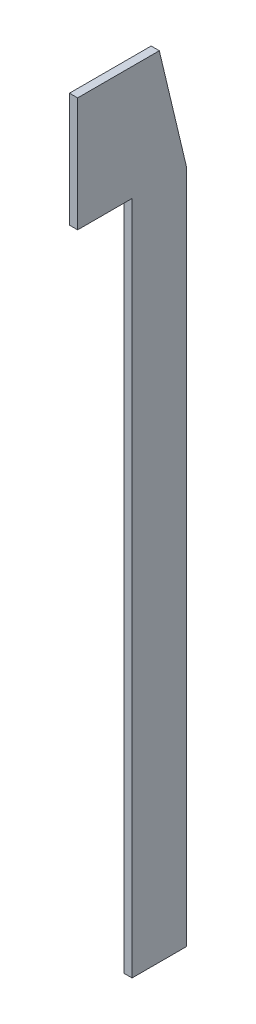
ISO-10303-21;
HEADER;
FILE_DESCRIPTION(('STEP AP214'),'2;1');
FILE_NAME('part.step','',(''),(''),'','','');
FILE_SCHEMA(('AUTOMOTIVE_DESIGN { 1 0 10303 214 1 1 1 1 }'));
ENDSEC;
DATA;
#1=APPLICATION_CONTEXT('core data for automotive mechanical design processes');
#2=APPLICATION_PROTOCOL_DEFINITION('international standard','automotive_design',2000,#1);
#3=PRODUCT_CONTEXT('',#1,'mechanical');
#4=PRODUCT('Part','Part','',(#3));
#5=PRODUCT_RELATED_PRODUCT_CATEGORY('part','',(#4));
#6=PRODUCT_DEFINITION_FORMATION('','',#4);
#7=PRODUCT_DEFINITION_CONTEXT('part definition',#1,'design');
#8=PRODUCT_DEFINITION('design','',#6,#7);
#9=PRODUCT_DEFINITION_SHAPE('','',#8);
#10=(LENGTH_UNIT() NAMED_UNIT(*) SI_UNIT(.MILLI.,.METRE.));
#11=(NAMED_UNIT(*) PLANE_ANGLE_UNIT() SI_UNIT($,.RADIAN.));
#12=(NAMED_UNIT(*) SI_UNIT($,.STERADIAN.) SOLID_ANGLE_UNIT());
#13=UNCERTAINTY_MEASURE_WITH_UNIT(LENGTH_MEASURE(1.E-05),#10,'distance_accuracy_value','');
#14=(GEOMETRIC_REPRESENTATION_CONTEXT(3) GLOBAL_UNCERTAINTY_ASSIGNED_CONTEXT((#13)) GLOBAL_UNIT_ASSIGNED_CONTEXT((#10,
#11,#12)) REPRESENTATION_CONTEXT('',''));
#15=CARTESIAN_POINT('',(0.,0.,0.));
#16=DIRECTION('',(0.,0.,1.));
#17=DIRECTION('',(1.,0.,0.));
#18=AXIS2_PLACEMENT_3D('',#15,#16,#17);
#19=CARTESIAN_POINT('',(3.,0.,0.));
#20=DIRECTION('',(0.,0.,-1.));
#21=DIRECTION('',(-1.,0.,0.));
#22=AXIS2_PLACEMENT_3D('',#19,#20,#21);
#23=PLANE('',#22);
#24=DIRECTION('',(0.,-1.,0.));
#25=VECTOR('',#24,1.);
#26=CARTESIAN_POINT('',(0.,0.,0.));
#27=LINE('',#26,#25);
#28=CARTESIAN_POINT('',(0.,248.,0.));
#29=VERTEX_POINT('',#28);
#30=CARTESIAN_POINT('',(0.,0.,0.));
#31=VERTEX_POINT('',#30);
#32=EDGE_CURVE('E124',#29,#31,#27,.T.);
#33=ORIENTED_EDGE('',*,*,#32,.T.);
#34=DIRECTION('',(-1.,0.,0.));
#35=VECTOR('',#34,1.);
#36=CARTESIAN_POINT('',(3.,0.,0.));
#37=LINE('',#36,#35);
#38=CARTESIAN_POINT('',(3.,0.,0.));
#39=VERTEX_POINT('',#38);
#40=EDGE_CURVE('E11',#39,#31,#37,.T.);
#41=ORIENTED_EDGE('',*,*,#40,.F.);
#42=DIRECTION('',(0.,-1.,0.));
#43=VECTOR('',#42,1.);
#44=CARTESIAN_POINT('',(3.,0.,0.));
#45=LINE('',#44,#43);
#46=CARTESIAN_POINT('',(3.,248.,0.));
#47=VERTEX_POINT('',#46);
#48=EDGE_CURVE('E136',#47,#39,#45,.T.);
#49=ORIENTED_EDGE('',*,*,#48,.F.);
#50=DIRECTION('',(-1.,0.,0.));
#51=VECTOR('',#50,1.);
#52=CARTESIAN_POINT('',(3.,248.,0.));
#53=LINE('',#52,#51);
#54=EDGE_CURVE('E120',#47,#29,#53,.T.);
#55=ORIENTED_EDGE('',*,*,#54,.T.);
#56=EDGE_LOOP('',(#33,#41,#49,#55));
#57=FACE_BOUND('',#56,.T.);
#58=ADVANCED_FACE('F33',(#57),#23,.F.);
#59=CARTESIAN_POINT('',(3.,0.,0.));
#60=DIRECTION('',(0.,1.,0.));
#61=DIRECTION('',(0.,0.,1.));
#62=AXIS2_PLACEMENT_3D('',#59,#60,#61);
#63=PLANE('',#62);
#64=DIRECTION('',(0.,0.,-1.));
#65=VECTOR('',#64,1.);
#66=CARTESIAN_POINT('',(0.,0.,0.));
#67=LINE('',#66,#65);
#68=CARTESIAN_POINT('',(0.,0.,-20.));
#69=VERTEX_POINT('',#68);
#70=EDGE_CURVE('E127',#31,#69,#67,.T.);
#71=ORIENTED_EDGE('',*,*,#70,.T.);
#72=DIRECTION('',(-1.,0.,0.));
#73=VECTOR('',#72,1.);
#74=CARTESIAN_POINT('',(3.,0.,-20.));
#75=LINE('',#74,#73);
#76=CARTESIAN_POINT('',(3.,0.,-20.));
#77=VERTEX_POINT('',#76);
#78=EDGE_CURVE('E40',#77,#69,#75,.T.);
#79=ORIENTED_EDGE('',*,*,#78,.F.);
#80=DIRECTION('',(0.,0.,-1.));
#81=VECTOR('',#80,1.);
#82=CARTESIAN_POINT('',(3.,0.,0.));
#83=LINE('',#82,#81);
#84=EDGE_CURVE('E88',#39,#77,#83,.T.);
#85=ORIENTED_EDGE('',*,*,#84,.F.);
#86=ORIENTED_EDGE('',*,*,#40,.T.);
#87=EDGE_LOOP('',(#71,#79,#85,#86));
#88=FACE_BOUND('',#87,.T.);
#89=ADVANCED_FACE('F165',(#88),#63,.F.);
#90=CARTESIAN_POINT('',(3.,0.,-20.));
#91=DIRECTION('',(0.,0.,1.));
#92=DIRECTION('',(1.,0.,0.));
#93=AXIS2_PLACEMENT_3D('',#90,#91,#92);
#94=PLANE('',#93);
#95=DIRECTION('',(0.,1.,0.));
#96=VECTOR('',#95,1.);
#97=CARTESIAN_POINT('',(0.,0.,-20.));
#98=LINE('',#97,#96);
#99=CARTESIAN_POINT('',(0.,248.,-20.));
#100=VERTEX_POINT('',#99);
#101=EDGE_CURVE('E129',#69,#100,#98,.T.);
#102=ORIENTED_EDGE('',*,*,#101,.T.);
#103=DIRECTION('',(1.,0.,0.));
#104=VECTOR('',#103,1.);
#105=CARTESIAN_POINT('',(0.,248.,-20.));
#106=LINE('',#105,#104);
#107=CARTESIAN_POINT('',(3.,248.,-20.));
#108=VERTEX_POINT('',#107);
#109=EDGE_CURVE('E47',#100,#108,#106,.T.);
#110=ORIENTED_EDGE('',*,*,#109,.T.);
#111=DIRECTION('',(0.,1.,0.));
#112=VECTOR('',#111,1.);
#113=CARTESIAN_POINT('',(3.,0.,-20.));
#114=LINE('',#113,#112);
#115=EDGE_CURVE('E107',#77,#108,#114,.T.);
#116=ORIENTED_EDGE('',*,*,#115,.F.);
#117=ORIENTED_EDGE('',*,*,#78,.T.);
#118=EDGE_LOOP('',(#102,#110,#116,#117));
#119=FACE_BOUND('',#118,.T.);
#120=ADVANCED_FACE('F142',(#119),#94,.F.);
#121=CARTESIAN_POINT('',(3.,290.,-20.));
#122=DIRECTION('',(0.,-1.,0.));
#123=DIRECTION('',(0.,0.,-1.));
#124=AXIS2_PLACEMENT_3D('',#121,#122,#123);
#125=PLANE('',#124);
#126=DIRECTION('',(0.,0.,1.));
#127=VECTOR('',#126,1.);
#128=CARTESIAN_POINT('',(3.,290.,-20.));
#129=LINE('',#128,#127);
#130=CARTESIAN_POINT('',(3.,290.,-9.99999999999999));
#131=VERTEX_POINT('',#130);
#132=CARTESIAN_POINT('',(3.,290.,20.));
#133=VERTEX_POINT('',#132);
#134=EDGE_CURVE('E96',#131,#133,#129,.T.);
#135=ORIENTED_EDGE('',*,*,#134,.F.);
#136=DIRECTION('',(1.,0.,0.));
#137=VECTOR('',#136,1.);
#138=CARTESIAN_POINT('',(0.,290.,-9.99999999999999));
#139=LINE('',#138,#137);
#140=CARTESIAN_POINT('',(0.,290.,-9.99999999999999));
#141=VERTEX_POINT('',#140);
#142=EDGE_CURVE('E148',#141,#131,#139,.T.);
#143=ORIENTED_EDGE('',*,*,#142,.F.);
#144=DIRECTION('',(0.,0.,1.));
#145=VECTOR('',#144,1.);
#146=CARTESIAN_POINT('',(0.,290.,-20.));
#147=LINE('',#146,#145);
#148=CARTESIAN_POINT('',(0.,290.,20.));
#149=VERTEX_POINT('',#148);
#150=EDGE_CURVE('E113',#141,#149,#147,.T.);
#151=ORIENTED_EDGE('',*,*,#150,.T.);
#152=DIRECTION('',(-1.,0.,0.));
#153=VECTOR('',#152,1.);
#154=CARTESIAN_POINT('',(3.,290.,20.));
#155=LINE('',#154,#153);
#156=EDGE_CURVE('E110',#133,#149,#155,.T.);
#157=ORIENTED_EDGE('',*,*,#156,.F.);
#158=EDGE_LOOP('',(#135,#143,#151,#157));
#159=FACE_BOUND('',#158,.T.);
#160=ADVANCED_FACE('F111',(#159),#125,.F.);
#161=CARTESIAN_POINT('',(3.,290.,20.));
#162=DIRECTION('',(0.,0.,-1.));
#163=DIRECTION('',(0.,1.,0.));
#164=AXIS2_PLACEMENT_3D('',#161,#162,#163);
#165=PLANE('',#164);
#166=DIRECTION('',(0.,-1.,0.));
#167=VECTOR('',#166,1.);
#168=CARTESIAN_POINT('',(0.,290.,20.));
#169=LINE('',#168,#167);
#170=CARTESIAN_POINT('',(0.,248.,20.));
#171=VERTEX_POINT('',#170);
#172=EDGE_CURVE('E133',#149,#171,#169,.T.);
#173=ORIENTED_EDGE('',*,*,#172,.T.);
#174=DIRECTION('',(-1.,0.,0.));
#175=VECTOR('',#174,1.);
#176=CARTESIAN_POINT('',(3.,248.,20.));
#177=LINE('',#176,#175);
#178=CARTESIAN_POINT('',(3.,248.,20.));
#179=VERTEX_POINT('',#178);
#180=EDGE_CURVE('E116',#179,#171,#177,.T.);
#181=ORIENTED_EDGE('',*,*,#180,.F.);
#182=DIRECTION('',(0.,-1.,0.));
#183=VECTOR('',#182,1.);
#184=CARTESIAN_POINT('',(3.,290.,20.));
#185=LINE('',#184,#183);
#186=EDGE_CURVE('E100',#133,#179,#185,.T.);
#187=ORIENTED_EDGE('',*,*,#186,.F.);
#188=ORIENTED_EDGE('',*,*,#156,.T.);
#189=EDGE_LOOP('',(#173,#181,#187,#188));
#190=FACE_BOUND('',#189,.T.);
#191=ADVANCED_FACE('F118',(#190),#165,.F.);
#192=CARTESIAN_POINT('',(3.,248.,0.));
#193=DIRECTION('',(0.,1.,0.));
#194=DIRECTION('',(0.,0.,1.));
#195=AXIS2_PLACEMENT_3D('',#192,#193,#194);
#196=PLANE('',#195);
#197=DIRECTION('',(0.,0.,-1.));
#198=VECTOR('',#197,1.);
#199=CARTESIAN_POINT('',(0.,248.,0.));
#200=LINE('',#199,#198);
#201=EDGE_CURVE('E80',#171,#29,#200,.T.);
#202=ORIENTED_EDGE('',*,*,#201,.T.);
#203=ORIENTED_EDGE('',*,*,#54,.F.);
#204=DIRECTION('',(0.,0.,-1.));
#205=VECTOR('',#204,1.);
#206=CARTESIAN_POINT('',(3.,248.,0.));
#207=LINE('',#206,#205);
#208=EDGE_CURVE('E56',#179,#47,#207,.T.);
#209=ORIENTED_EDGE('',*,*,#208,.F.);
#210=ORIENTED_EDGE('',*,*,#180,.T.);
#211=EDGE_LOOP('',(#202,#203,#209,#210));
#212=FACE_BOUND('',#211,.T.);
#213=ADVANCED_FACE('F172',(#212),#196,.F.);
#214=CARTESIAN_POINT('',(3.,0.,0.));
#215=DIRECTION('',(1.,0.,0.));
#216=DIRECTION('',(0.,0.,-1.));
#217=AXIS2_PLACEMENT_3D('',#214,#215,#216);
#218=PLANE('',#217);
#219=DIRECTION('',(0.,-0.972806214685367,-0.23162052730604));
#220=VECTOR('',#219,1.);
#221=CARTESIAN_POINT('',(3.,290.,-9.99999999999999));
#222=LINE('',#221,#220);
#223=EDGE_CURVE('E104',#131,#108,#222,.T.);
#224=ORIENTED_EDGE('',*,*,#223,.F.);
#225=ORIENTED_EDGE('',*,*,#134,.T.);
#226=ORIENTED_EDGE('',*,*,#186,.T.);
#227=ORIENTED_EDGE('',*,*,#208,.T.);
#228=ORIENTED_EDGE('',*,*,#48,.T.);
#229=ORIENTED_EDGE('',*,*,#84,.T.);
#230=ORIENTED_EDGE('',*,*,#115,.T.);
#231=EDGE_LOOP('',(#224,#225,#226,#227,#228,#229,#230));
#232=FACE_BOUND('',#231,.T.);
#233=ADVANCED_FACE('F98',(#232),#218,.T.);
#234=CARTESIAN_POINT('',(0.,0.,0.));
#235=DIRECTION('',(1.,0.,0.));
#236=DIRECTION('',(0.,0.,-1.));
#237=AXIS2_PLACEMENT_3D('',#234,#235,#236);
#238=PLANE('',#237);
#239=ORIENTED_EDGE('',*,*,#150,.F.);
#240=DIRECTION('',(0.,-0.972806214685367,-0.23162052730604));
#241=VECTOR('',#240,1.);
#242=CARTESIAN_POINT('',(0.,290.,-9.99999999999999));
#243=LINE('',#242,#241);
#244=EDGE_CURVE('E146',#141,#100,#243,.T.);
#245=ORIENTED_EDGE('',*,*,#244,.T.);
#246=ORIENTED_EDGE('',*,*,#101,.F.);
#247=ORIENTED_EDGE('',*,*,#70,.F.);
#248=ORIENTED_EDGE('',*,*,#32,.F.);
#249=ORIENTED_EDGE('',*,*,#201,.F.);
#250=ORIENTED_EDGE('',*,*,#172,.F.);
#251=EDGE_LOOP('',(#239,#245,#246,#247,#248,#249,#250));
#252=FACE_BOUND('',#251,.T.);
#253=ADVANCED_FACE('F144',(#252),#238,.F.);
#254=CARTESIAN_POINT('',(0.,290.,-9.99999999999999));
#255=DIRECTION('',(0.,-0.23162052730604,0.972806214685367));
#256=DIRECTION('',(0.,-0.972806214685367,-0.23162052730604));
#257=AXIS2_PLACEMENT_3D('',#254,#255,#256);
#258=PLANE('',#257);
#259=ORIENTED_EDGE('',*,*,#223,.T.);
#260=ORIENTED_EDGE('',*,*,#109,.F.);
#261=ORIENTED_EDGE('',*,*,#244,.F.);
#262=ORIENTED_EDGE('',*,*,#142,.T.);
#263=EDGE_LOOP('',(#259,#260,#261,#262));
#264=FACE_BOUND('',#263,.T.);
#265=ADVANCED_FACE('F156',(#264),#258,.F.);
#266=CLOSED_SHELL('',(#58,#89,#120,#160,#191,#213,#233,#253,#265));
#267=MANIFOLD_SOLID_BREP('B2',#266);
#268=ADVANCED_BREP_SHAPE_REPRESENTATION('',(#18,#267),#14);
#269=SHAPE_DEFINITION_REPRESENTATION(#9,#268);
ENDSEC;
END-ISO-10303-21;
